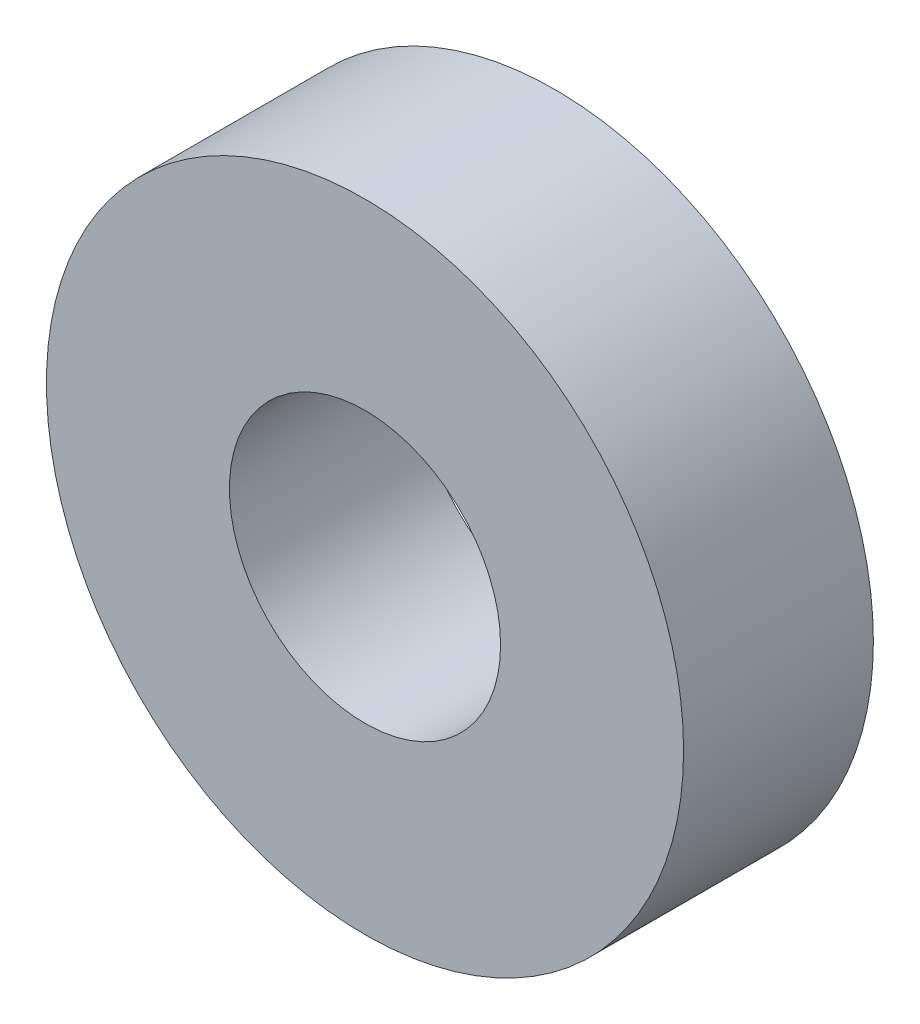
ISO-10303-21;
HEADER;
FILE_DESCRIPTION(('STEP AP214'),'2;1');
FILE_NAME('part.step','',(''),(''),'','','');
FILE_SCHEMA(('AUTOMOTIVE_DESIGN { 1 0 10303 214 1 1 1 1 }'));
ENDSEC;
DATA;
#1=APPLICATION_CONTEXT('core data for automotive mechanical design processes');
#2=APPLICATION_PROTOCOL_DEFINITION('international standard','automotive_design',2000,#1);
#3=PRODUCT_CONTEXT('',#1,'mechanical');
#4=PRODUCT('Part','Part','',(#3));
#5=PRODUCT_RELATED_PRODUCT_CATEGORY('part','',(#4));
#6=PRODUCT_DEFINITION_FORMATION('','',#4);
#7=PRODUCT_DEFINITION_CONTEXT('part definition',#1,'design');
#8=PRODUCT_DEFINITION('design','',#6,#7);
#9=PRODUCT_DEFINITION_SHAPE('','',#8);
#10=(LENGTH_UNIT() NAMED_UNIT(*) SI_UNIT(.MILLI.,.METRE.));
#11=(NAMED_UNIT(*) PLANE_ANGLE_UNIT() SI_UNIT($,.RADIAN.));
#12=(NAMED_UNIT(*) SI_UNIT($,.STERADIAN.) SOLID_ANGLE_UNIT());
#13=UNCERTAINTY_MEASURE_WITH_UNIT(LENGTH_MEASURE(1.E-05),#10,'distance_accuracy_value','');
#14=(GEOMETRIC_REPRESENTATION_CONTEXT(3) GLOBAL_UNCERTAINTY_ASSIGNED_CONTEXT((#13)) GLOBAL_UNIT_ASSIGNED_CONTEXT((#10,
#11,#12)) REPRESENTATION_CONTEXT('',''));
#15=CARTESIAN_POINT('',(0.,0.,0.));
#16=DIRECTION('',(0.,0.,1.));
#17=DIRECTION('',(1.,0.,0.));
#18=AXIS2_PLACEMENT_3D('',#15,#16,#17);
#19=CARTESIAN_POINT('',(0.,0.,45.));
#20=DIRECTION('',(0.,0.,1.));
#21=DIRECTION('',(1.,0.,0.));
#22=AXIS2_PLACEMENT_3D('',#19,#20,#21);
#23=PLANE('',#22);
#24=CARTESIAN_POINT('',(0.,0.,45.));
#25=DIRECTION('',(0.,0.,1.));
#26=DIRECTION('',(1.,0.,0.));
#27=AXIS2_PLACEMENT_3D('',#24,#25,#26);
#28=CIRCLE('',#27,23.5);
#29=CARTESIAN_POINT('',(23.5,0.,45.));
#30=VERTEX_POINT('',#29);
#31=EDGE_CURVE('E10',#30,#30,#28,.T.);
#32=ORIENTED_EDGE('',*,*,#31,.T.);
#33=EDGE_LOOP('',(#32));
#34=FACE_BOUND('',#33,.T.);
#35=CARTESIAN_POINT('',(0.,0.,45.));
#36=DIRECTION('',(0.,0.,1.));
#37=DIRECTION('',(1.,0.,0.));
#38=AXIS2_PLACEMENT_3D('',#35,#36,#37);
#39=CIRCLE('',#38,10.);
#40=CARTESIAN_POINT('',(10.,0.,45.));
#41=VERTEX_POINT('',#40);
#42=EDGE_CURVE('E46',#41,#41,#39,.T.);
#43=ORIENTED_EDGE('',*,*,#42,.F.);
#44=EDGE_LOOP('',(#43));
#45=FACE_BOUND('',#44,.T.);
#46=ADVANCED_FACE('F35',(#34,#45),#23,.T.);
#47=CARTESIAN_POINT('',(0.,0.,31.));
#48=DIRECTION('',(0.,0.,1.));
#49=DIRECTION('',(1.,0.,0.));
#50=AXIS2_PLACEMENT_3D('',#47,#48,#49);
#51=PLANE('',#50);
#52=CARTESIAN_POINT('',(0.,0.,31.));
#53=DIRECTION('',(0.,0.,1.));
#54=DIRECTION('',(1.,0.,0.));
#55=AXIS2_PLACEMENT_3D('',#52,#53,#54);
#56=CIRCLE('',#55,23.5);
#57=CARTESIAN_POINT('',(23.5,0.,31.));
#58=VERTEX_POINT('',#57);
#59=EDGE_CURVE('E39',#58,#58,#56,.T.);
#60=ORIENTED_EDGE('',*,*,#59,.F.);
#61=EDGE_LOOP('',(#60));
#62=FACE_BOUND('',#61,.T.);
#63=CARTESIAN_POINT('',(0.,0.,31.));
#64=DIRECTION('',(0.,0.,1.));
#65=DIRECTION('',(1.,0.,0.));
#66=AXIS2_PLACEMENT_3D('',#63,#64,#65);
#67=CIRCLE('',#66,10.);
#68=CARTESIAN_POINT('',(10.,0.,31.));
#69=VERTEX_POINT('',#68);
#70=EDGE_CURVE('E48',#69,#69,#67,.T.);
#71=ORIENTED_EDGE('',*,*,#70,.T.);
#72=EDGE_LOOP('',(#71));
#73=FACE_BOUND('',#72,.T.);
#74=ADVANCED_FACE('F58',(#62,#73),#51,.F.);
#75=CARTESIAN_POINT('',(0.,0.,45.));
#76=DIRECTION('',(0.,0.,-1.));
#77=DIRECTION('',(-1.,0.,0.));
#78=AXIS2_PLACEMENT_3D('',#75,#76,#77);
#79=CYLINDRICAL_SURFACE('',#78,23.5);
#80=ORIENTED_EDGE('',*,*,#31,.F.);
#81=EDGE_LOOP('',(#80));
#82=FACE_BOUND('',#81,.T.);
#83=ORIENTED_EDGE('',*,*,#59,.T.);
#84=EDGE_LOOP('',(#83));
#85=FACE_BOUND('',#84,.T.);
#86=ADVANCED_FACE('F37',(#82,#85),#79,.T.);
#87=CARTESIAN_POINT('',(0.,0.,45.));
#88=DIRECTION('',(0.,0.,-1.));
#89=DIRECTION('',(-1.,0.,0.));
#90=AXIS2_PLACEMENT_3D('',#87,#88,#89);
#91=CYLINDRICAL_SURFACE('',#90,10.);
#92=ORIENTED_EDGE('',*,*,#42,.T.);
#93=EDGE_LOOP('',(#92));
#94=FACE_BOUND('',#93,.T.);
#95=ORIENTED_EDGE('',*,*,#70,.F.);
#96=EDGE_LOOP('',(#95));
#97=FACE_BOUND('',#96,.T.);
#98=ADVANCED_FACE('F54',(#94,#97),#91,.F.);
#99=CLOSED_SHELL('',(#46,#74,#86,#98));
#100=MANIFOLD_SOLID_BREP('B2',#99);
#101=ADVANCED_BREP_SHAPE_REPRESENTATION('',(#18,#100),#14);
#102=SHAPE_DEFINITION_REPRESENTATION(#9,#101);
ENDSEC;
END-ISO-10303-21;
